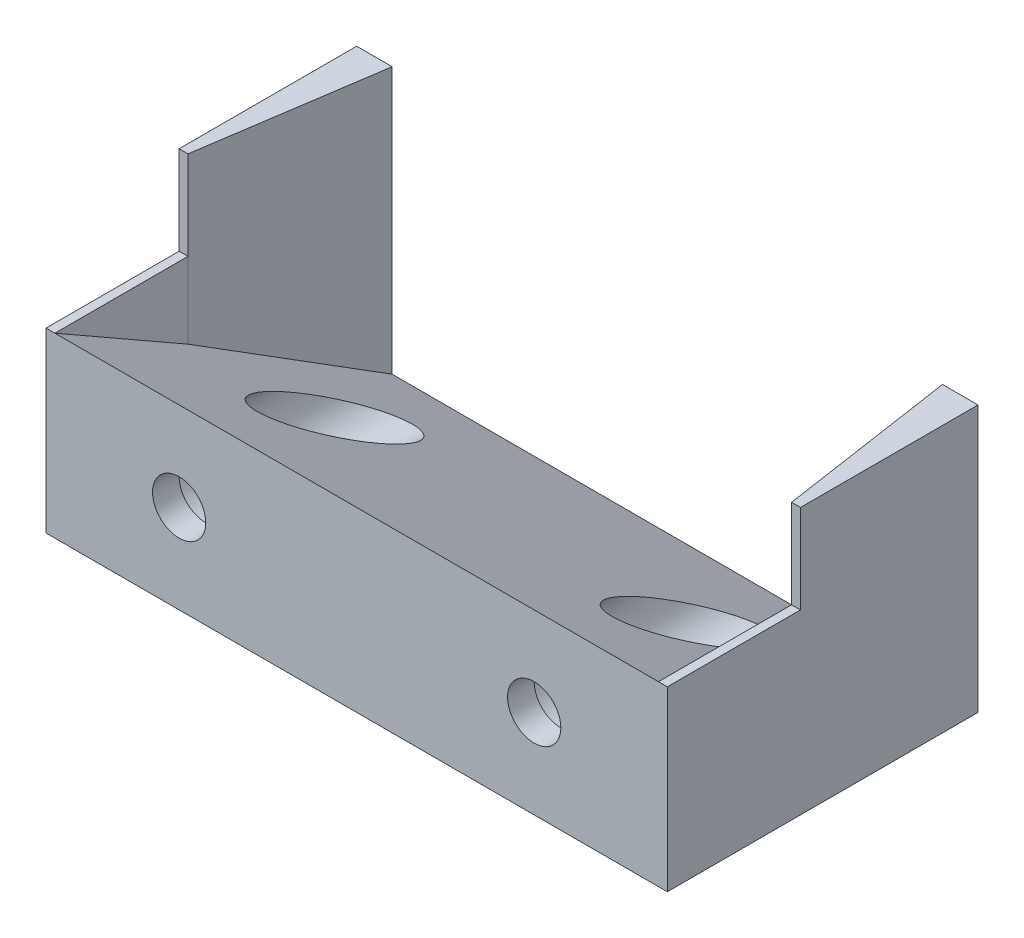
ISO-10303-21;
HEADER;
FILE_DESCRIPTION(('STEP AP214'),'2;1');
FILE_NAME('part.step','',(''),(''),'','','');
FILE_SCHEMA(('AUTOMOTIVE_DESIGN { 1 0 10303 214 1 1 1 1 }'));
ENDSEC;
DATA;
#1=APPLICATION_CONTEXT('core data for automotive mechanical design processes');
#2=APPLICATION_PROTOCOL_DEFINITION('international standard','automotive_design',2000,#1);
#3=PRODUCT_CONTEXT('',#1,'mechanical');
#4=PRODUCT('Part','Part','',(#3));
#5=PRODUCT_RELATED_PRODUCT_CATEGORY('part','',(#4));
#6=PRODUCT_DEFINITION_FORMATION('','',#4);
#7=PRODUCT_DEFINITION_CONTEXT('part definition',#1,'design');
#8=PRODUCT_DEFINITION('design','',#6,#7);
#9=PRODUCT_DEFINITION_SHAPE('','',#8);
#10=(LENGTH_UNIT() NAMED_UNIT(*) SI_UNIT(.MILLI.,.METRE.));
#11=(NAMED_UNIT(*) PLANE_ANGLE_UNIT() SI_UNIT($,.RADIAN.));
#12=(NAMED_UNIT(*) SI_UNIT($,.STERADIAN.) SOLID_ANGLE_UNIT());
#13=UNCERTAINTY_MEASURE_WITH_UNIT(LENGTH_MEASURE(1.E-05),#10,'distance_accuracy_value','');
#14=(GEOMETRIC_REPRESENTATION_CONTEXT(3) GLOBAL_UNCERTAINTY_ASSIGNED_CONTEXT((#13)) GLOBAL_UNIT_ASSIGNED_CONTEXT((#10,
#11,#12)) REPRESENTATION_CONTEXT('',''));
#15=CARTESIAN_POINT('',(0.,0.,0.));
#16=DIRECTION('',(0.,0.,1.));
#17=DIRECTION('',(1.,0.,0.));
#18=AXIS2_PLACEMENT_3D('',#15,#16,#17);
#19=CARTESIAN_POINT('',(-20.,-10.,30.));
#20=DIRECTION('',(0.,0.,-1.));
#21=DIRECTION('',(-1.,0.,0.));
#22=AXIS2_PLACEMENT_3D('',#19,#20,#21);
#23=CYLINDRICAL_SURFACE('',#22,5.);
#24=CARTESIAN_POINT('',(-20.,-10.,-2.5));
#25=DIRECTION('',(0.,0.868243142124459,-0.496138938356834));
#26=DIRECTION('',(0.,-0.496138938356834,-0.868243142124459));
#27=AXIS2_PLACEMENT_3D('',#24,#25,#26);
#28=ELLIPSE('',#27,10.0778221853732,5.);
#29=CARTESIAN_POINT('',(-20.,-15.,-11.25));
#30=VERTEX_POINT('',#29);
#31=EDGE_CURVE('E197',#30,#30,#28,.F.);
#32=ORIENTED_EDGE('',*,*,#31,.F.);
#33=EDGE_LOOP('',(#32));
#34=FACE_BOUND('',#33,.T.);
#35=CARTESIAN_POINT('',(-20.,-10.,12.));
#36=DIRECTION('',(0.,0.,1.));
#37=DIRECTION('',(1.,0.,0.));
#38=AXIS2_PLACEMENT_3D('',#35,#36,#37);
#39=CIRCLE('',#38,5.);
#40=CARTESIAN_POINT('',(-15.,-10.,12.));
#41=VERTEX_POINT('',#40);
#42=EDGE_CURVE('E193',#41,#41,#39,.F.);
#43=ORIENTED_EDGE('',*,*,#42,.F.);
#44=EDGE_LOOP('',(#43));
#45=FACE_BOUND('',#44,.T.);
#46=ADVANCED_FACE('F40',(#34,#45),#23,.F.);
#47=CARTESIAN_POINT('',(20.,-9.99999999999999,30.));
#48=DIRECTION('',(0.,0.,-1.));
#49=DIRECTION('',(-1.,0.,0.));
#50=AXIS2_PLACEMENT_3D('',#47,#48,#49);
#51=CYLINDRICAL_SURFACE('',#50,5.);
#52=CARTESIAN_POINT('',(20.,-9.99999999999999,-2.49999999999999));
#53=DIRECTION('',(0.,0.868243142124459,-0.496138938356834));
#54=DIRECTION('',(0.,-0.496138938356834,-0.868243142124459));
#55=AXIS2_PLACEMENT_3D('',#52,#53,#54);
#56=ELLIPSE('',#55,10.0778221853732,5.);
#57=CARTESIAN_POINT('',(20.,-15.,-11.25));
#58=VERTEX_POINT('',#57);
#59=EDGE_CURVE('E187',#58,#58,#56,.F.);
#60=ORIENTED_EDGE('',*,*,#59,.F.);
#61=EDGE_LOOP('',(#60));
#62=FACE_BOUND('',#61,.T.);
#63=CARTESIAN_POINT('',(20.,-9.99999999999999,12.));
#64=DIRECTION('',(0.,0.,1.));
#65=DIRECTION('',(1.,0.,0.));
#66=AXIS2_PLACEMENT_3D('',#63,#64,#65);
#67=CIRCLE('',#66,5.);
#68=CARTESIAN_POINT('',(25.,-9.99999999999999,12.));
#69=VERTEX_POINT('',#68);
#70=EDGE_CURVE('E190',#69,#69,#67,.F.);
#71=ORIENTED_EDGE('',*,*,#70,.F.);
#72=EDGE_LOOP('',(#71));
#73=FACE_BOUND('',#72,.T.);
#74=ADVANCED_FACE('F310',(#62,#73),#51,.F.);
#75=CARTESIAN_POINT('',(-35.,0.,15.));
#76=DIRECTION('',(0.,-1.,0.));
#77=DIRECTION('',(0.,0.,-1.));
#78=AXIS2_PLACEMENT_3D('',#75,#76,#77);
#79=PLANE('',#78);
#80=DIRECTION('',(-1.,0.,0.));
#81=VECTOR('',#80,1.);
#82=CARTESIAN_POINT('',(35.,0.,0.));
#83=LINE('',#82,#81);
#84=CARTESIAN_POINT('',(35.,0.,0.));
#85=VERTEX_POINT('',#84);
#86=CARTESIAN_POINT('',(34.,0.,0.));
#87=VERTEX_POINT('',#86);
#88=EDGE_CURVE('E194',#85,#87,#83,.T.);
#89=ORIENTED_EDGE('',*,*,#88,.T.);
#90=DIRECTION('',(0.,0.,-1.));
#91=VECTOR('',#90,1.);
#92=CARTESIAN_POINT('',(34.,0.,0.));
#93=LINE('',#92,#91);
#94=CARTESIAN_POINT('',(34.,0.,15.));
#95=VERTEX_POINT('',#94);
#96=EDGE_CURVE('E174',#95,#87,#93,.T.);
#97=ORIENTED_EDGE('',*,*,#96,.F.);
#98=DIRECTION('',(-1.,0.,0.));
#99=VECTOR('',#98,1.);
#100=CARTESIAN_POINT('',(-35.,0.,15.));
#101=LINE('',#100,#99);
#102=CARTESIAN_POINT('',(35.,0.,15.));
#103=VERTEX_POINT('',#102);
#104=EDGE_CURVE('E230',#103,#95,#101,.T.);
#105=ORIENTED_EDGE('',*,*,#104,.F.);
#106=DIRECTION('',(0.,0.,-1.));
#107=VECTOR('',#106,1.);
#108=CARTESIAN_POINT('',(35.,0.,15.));
#109=LINE('',#108,#107);
#110=EDGE_CURVE('E237',#103,#85,#109,.T.);
#111=ORIENTED_EDGE('',*,*,#110,.T.);
#112=EDGE_LOOP('',(#89,#97,#105,#111));
#113=FACE_BOUND('',#112,.T.);
#114=ADVANCED_FACE('F288',(#113),#79,.F.);
#115=CARTESIAN_POINT('',(35.,-20.,0.));
#116=DIRECTION('',(0.,1.,0.));
#117=DIRECTION('',(0.,0.,1.));
#118=AXIS2_PLACEMENT_3D('',#115,#116,#117);
#119=PLANE('',#118);
#120=DIRECTION('',(-1.,0.,0.));
#121=VECTOR('',#120,1.);
#122=CARTESIAN_POINT('',(35.,-20.,-20.));
#123=LINE('',#122,#121);
#124=CARTESIAN_POINT('',(31.,-20.,-20.));
#125=VERTEX_POINT('',#124);
#126=CARTESIAN_POINT('',(-31.,-20.,-20.));
#127=VERTEX_POINT('',#126);
#128=EDGE_CURVE('E243',#125,#127,#123,.T.);
#129=ORIENTED_EDGE('',*,*,#128,.F.);
#130=CARTESIAN_POINT('',(35.,-20.,-20.));
#131=VERTEX_POINT('',#130);
#132=EDGE_CURVE('E55',#131,#125,#123,.T.);
#133=ORIENTED_EDGE('',*,*,#132,.F.);
#134=DIRECTION('',(0.,0.,-1.));
#135=VECTOR('',#134,1.);
#136=CARTESIAN_POINT('',(35.,-20.,0.));
#137=LINE('',#136,#135);
#138=CARTESIAN_POINT('',(35.,-20.,15.));
#139=VERTEX_POINT('',#138);
#140=EDGE_CURVE('E241',#139,#131,#137,.T.);
#141=ORIENTED_EDGE('',*,*,#140,.F.);
#142=DIRECTION('',(1.,0.,0.));
#143=VECTOR('',#142,1.);
#144=CARTESIAN_POINT('',(-35.,-20.,15.));
#145=LINE('',#144,#143);
#146=CARTESIAN_POINT('',(-35.,-20.,15.));
#147=VERTEX_POINT('',#146);
#148=EDGE_CURVE('E224',#147,#139,#145,.T.);
#149=ORIENTED_EDGE('',*,*,#148,.F.);
#150=DIRECTION('',(0.,0.,-1.));
#151=VECTOR('',#150,1.);
#152=CARTESIAN_POINT('',(-35.,-20.,0.));
#153=LINE('',#152,#151);
#154=CARTESIAN_POINT('',(-35.,-20.,-20.));
#155=VERTEX_POINT('',#154);
#156=EDGE_CURVE('E240',#147,#155,#153,.T.);
#157=ORIENTED_EDGE('',*,*,#156,.T.);
#158=DIRECTION('',(1.,0.,0.));
#159=VECTOR('',#158,1.);
#160=CARTESIAN_POINT('',(-35.,-20.,-20.));
#161=LINE('',#160,#159);
#162=EDGE_CURVE('E206',#155,#127,#161,.T.);
#163=ORIENTED_EDGE('',*,*,#162,.T.);
#164=EDGE_LOOP('',(#129,#133,#141,#149,#157,#163));
#165=FACE_BOUND('',#164,.T.);
#166=ADVANCED_FACE('F42',(#165),#119,.F.);
#167=CARTESIAN_POINT('',(35.,0.,0.));
#168=DIRECTION('',(1.,0.,0.));
#169=DIRECTION('',(0.,0.,-1.));
#170=AXIS2_PLACEMENT_3D('',#167,#168,#169);
#171=PLANE('',#170);
#172=ORIENTED_EDGE('',*,*,#110,.F.);
#173=DIRECTION('',(0.,1.,0.));
#174=VECTOR('',#173,1.);
#175=CARTESIAN_POINT('',(35.,0.,15.));
#176=LINE('',#175,#174);
#177=EDGE_CURVE('E227',#139,#103,#176,.T.);
#178=ORIENTED_EDGE('',*,*,#177,.F.);
#179=ORIENTED_EDGE('',*,*,#140,.T.);
#180=DIRECTION('',(0.,-1.,0.));
#181=VECTOR('',#180,1.);
#182=CARTESIAN_POINT('',(35.,10.,-20.));
#183=LINE('',#182,#181);
#184=CARTESIAN_POINT('',(35.,10.,-20.));
#185=VERTEX_POINT('',#184);
#186=EDGE_CURVE('E200',#185,#131,#183,.T.);
#187=ORIENTED_EDGE('',*,*,#186,.F.);
#188=DIRECTION('',(0.,0.,1.));
#189=VECTOR('',#188,1.);
#190=CARTESIAN_POINT('',(35.,10.,0.));
#191=LINE('',#190,#189);
#192=CARTESIAN_POINT('',(35.,10.,0.));
#193=VERTEX_POINT('',#192);
#194=EDGE_CURVE('E135',#185,#193,#191,.T.);
#195=ORIENTED_EDGE('',*,*,#194,.T.);
#196=DIRECTION('',(0.,-1.,0.));
#197=VECTOR('',#196,1.);
#198=CARTESIAN_POINT('',(35.,10.,0.));
#199=LINE('',#198,#197);
#200=EDGE_CURVE('E138',#193,#85,#199,.T.);
#201=ORIENTED_EDGE('',*,*,#200,.T.);
#202=EDGE_LOOP('',(#172,#178,#179,#187,#195,#201));
#203=FACE_BOUND('',#202,.T.);
#204=ADVANCED_FACE('F294',(#203),#171,.T.);
#205=CARTESIAN_POINT('',(-35.,0.,0.));
#206=DIRECTION('',(1.,0.,0.));
#207=DIRECTION('',(0.,0.,-1.));
#208=AXIS2_PLACEMENT_3D('',#205,#206,#207);
#209=PLANE('',#208);
#210=ORIENTED_EDGE('',*,*,#156,.F.);
#211=DIRECTION('',(0.,-1.,0.));
#212=VECTOR('',#211,1.);
#213=CARTESIAN_POINT('',(-35.,0.,15.));
#214=LINE('',#213,#212);
#215=CARTESIAN_POINT('',(-35.,0.,15.));
#216=VERTEX_POINT('',#215);
#217=EDGE_CURVE('E220',#216,#147,#214,.T.);
#218=ORIENTED_EDGE('',*,*,#217,.F.);
#219=DIRECTION('',(0.,0.,-1.));
#220=VECTOR('',#219,1.);
#221=CARTESIAN_POINT('',(-35.,0.,15.));
#222=LINE('',#221,#220);
#223=CARTESIAN_POINT('',(-35.,0.,0.));
#224=VERTEX_POINT('',#223);
#225=EDGE_CURVE('E233',#216,#224,#222,.T.);
#226=ORIENTED_EDGE('',*,*,#225,.T.);
#227=DIRECTION('',(0.,-1.,0.));
#228=VECTOR('',#227,1.);
#229=CARTESIAN_POINT('',(-35.,10.,0.));
#230=LINE('',#229,#228);
#231=CARTESIAN_POINT('',(-35.,10.,0.));
#232=VERTEX_POINT('',#231);
#233=EDGE_CURVE('E217',#232,#224,#230,.T.);
#234=ORIENTED_EDGE('',*,*,#233,.F.);
#235=DIRECTION('',(0.,0.,-1.));
#236=VECTOR('',#235,1.);
#237=CARTESIAN_POINT('',(-35.,10.,0.));
#238=LINE('',#237,#236);
#239=CARTESIAN_POINT('',(-35.,10.,-20.));
#240=VERTEX_POINT('',#239);
#241=EDGE_CURVE('E207',#232,#240,#238,.T.);
#242=ORIENTED_EDGE('',*,*,#241,.T.);
#243=DIRECTION('',(0.,-1.,0.));
#244=VECTOR('',#243,1.);
#245=CARTESIAN_POINT('',(-35.,10.,-20.));
#246=LINE('',#245,#244);
#247=EDGE_CURVE('E214',#240,#155,#246,.T.);
#248=ORIENTED_EDGE('',*,*,#247,.T.);
#249=EDGE_LOOP('',(#210,#218,#226,#234,#242,#248));
#250=FACE_BOUND('',#249,.T.);
#251=ADVANCED_FACE('F274',(#250),#209,.F.);
#252=CARTESIAN_POINT('',(-34.,0.,15.));
#253=VERTEX_POINT('',#252);
#254=EDGE_CURVE('E229',#253,#216,#101,.T.);
#255=ORIENTED_EDGE('',*,*,#254,.F.);
#256=DIRECTION('',(0.,0.,1.));
#257=VECTOR('',#256,1.);
#258=CARTESIAN_POINT('',(-34.,0.,0.));
#259=LINE('',#258,#257);
#260=CARTESIAN_POINT('',(-34.,0.,0.));
#261=VERTEX_POINT('',#260);
#262=EDGE_CURVE('E163',#261,#253,#259,.T.);
#263=ORIENTED_EDGE('',*,*,#262,.F.);
#264=EDGE_CURVE('E246',#261,#224,#83,.T.);
#265=ORIENTED_EDGE('',*,*,#264,.T.);
#266=ORIENTED_EDGE('',*,*,#225,.F.);
#267=EDGE_LOOP('',(#255,#263,#265,#266));
#268=FACE_BOUND('',#267,.T.);
#269=ADVANCED_FACE('F258',(#268),#79,.F.);
#270=CARTESIAN_POINT('',(0.,0.,15.));
#271=DIRECTION('',(0.,0.,1.));
#272=DIRECTION('',(1.,0.,0.));
#273=AXIS2_PLACEMENT_3D('',#270,#271,#272);
#274=PLANE('',#273);
#275=ORIENTED_EDGE('',*,*,#177,.T.);
#276=ORIENTED_EDGE('',*,*,#104,.T.);
#277=EDGE_CURVE('E234',#95,#253,#101,.T.);
#278=ORIENTED_EDGE('',*,*,#277,.T.);
#279=ORIENTED_EDGE('',*,*,#254,.T.);
#280=ORIENTED_EDGE('',*,*,#217,.T.);
#281=ORIENTED_EDGE('',*,*,#148,.T.);
#282=EDGE_LOOP('',(#275,#276,#278,#279,#280,#281));
#283=FACE_BOUND('',#282,.T.);
#284=CARTESIAN_POINT('',(20.,-9.99999999999999,15.));
#285=DIRECTION('',(0.,0.,1.));
#286=DIRECTION('',(1.,0.,0.));
#287=AXIS2_PLACEMENT_3D('',#284,#285,#286);
#288=CIRCLE('',#287,3.);
#289=CARTESIAN_POINT('',(23.,-9.99999999999999,15.));
#290=VERTEX_POINT('',#289);
#291=EDGE_CURVE('E177',#290,#290,#288,.T.);
#292=ORIENTED_EDGE('',*,*,#291,.F.);
#293=EDGE_LOOP('',(#292));
#294=FACE_BOUND('',#293,.T.);
#295=CARTESIAN_POINT('',(-20.,-10.,15.));
#296=DIRECTION('',(0.,0.,1.));
#297=DIRECTION('',(1.,0.,0.));
#298=AXIS2_PLACEMENT_3D('',#295,#296,#297);
#299=CIRCLE('',#298,3.);
#300=CARTESIAN_POINT('',(-17.,-10.,15.));
#301=VERTEX_POINT('',#300);
#302=EDGE_CURVE('E181',#301,#301,#299,.T.);
#303=ORIENTED_EDGE('',*,*,#302,.F.);
#304=EDGE_LOOP('',(#303));
#305=FACE_BOUND('',#304,.T.);
#306=ADVANCED_FACE('F278',(#283,#294,#305),#274,.T.);
#307=CARTESIAN_POINT('',(-35.,10.,0.));
#308=DIRECTION('',(0.,0.,1.));
#309=DIRECTION('',(1.,0.,0.));
#310=AXIS2_PLACEMENT_3D('',#307,#308,#309);
#311=PLANE('',#310);
#312=DIRECTION('',(0.,-1.,0.));
#313=VECTOR('',#312,1.);
#314=CARTESIAN_POINT('',(-34.,10.,0.));
#315=LINE('',#314,#313);
#316=CARTESIAN_POINT('',(-34.,9.99999999999999,0.));
#317=VERTEX_POINT('',#316);
#318=EDGE_CURVE('E169',#317,#261,#315,.T.);
#319=ORIENTED_EDGE('',*,*,#318,.F.);
#320=DIRECTION('',(-1.,0.,0.));
#321=VECTOR('',#320,1.);
#322=CARTESIAN_POINT('',(-35.,10.,0.));
#323=LINE('',#322,#321);
#324=EDGE_CURVE('E212',#317,#232,#323,.T.);
#325=ORIENTED_EDGE('',*,*,#324,.T.);
#326=ORIENTED_EDGE('',*,*,#233,.T.);
#327=ORIENTED_EDGE('',*,*,#264,.F.);
#328=EDGE_LOOP('',(#319,#325,#326,#327));
#329=FACE_BOUND('',#328,.T.);
#330=ADVANCED_FACE('F263',(#329),#311,.T.);
#331=CARTESIAN_POINT('',(-35.,10.,-20.));
#332=DIRECTION('',(0.,0.,-1.));
#333=DIRECTION('',(-1.,0.,0.));
#334=AXIS2_PLACEMENT_3D('',#331,#332,#333);
#335=PLANE('',#334);
#336=DIRECTION('',(1.,0.,0.));
#337=VECTOR('',#336,1.);
#338=CARTESIAN_POINT('',(-35.,10.,-20.));
#339=LINE('',#338,#337);
#340=CARTESIAN_POINT('',(-31.,9.99999999999999,-20.));
#341=VERTEX_POINT('',#340);
#342=EDGE_CURVE('E210',#240,#341,#339,.T.);
#343=ORIENTED_EDGE('',*,*,#342,.T.);
#344=DIRECTION('',(0.,-1.,0.));
#345=VECTOR('',#344,1.);
#346=CARTESIAN_POINT('',(-31.,9.99999999999999,-20.));
#347=LINE('',#346,#345);
#348=EDGE_CURVE('E157',#341,#127,#347,.T.);
#349=ORIENTED_EDGE('',*,*,#348,.T.);
#350=ORIENTED_EDGE('',*,*,#162,.F.);
#351=ORIENTED_EDGE('',*,*,#247,.F.);
#352=EDGE_LOOP('',(#343,#349,#350,#351));
#353=FACE_BOUND('',#352,.T.);
#354=ADVANCED_FACE('F299',(#353),#335,.T.);
#355=CARTESIAN_POINT('',(0.,10.,0.));
#356=DIRECTION('',(0.,-1.,0.));
#357=DIRECTION('',(0.,0.,-1.));
#358=AXIS2_PLACEMENT_3D('',#355,#356,#357);
#359=PLANE('',#358);
#360=ORIENTED_EDGE('',*,*,#324,.F.);
#361=DIRECTION('',(-0.148340452930245,0.,0.988936352868298));
#362=VECTOR('',#361,1.);
#363=CARTESIAN_POINT('',(-31.,9.99999999999999,-20.));
#364=LINE('',#363,#362);
#365=EDGE_CURVE('E152',#341,#317,#364,.T.);
#366=ORIENTED_EDGE('',*,*,#365,.F.);
#367=ORIENTED_EDGE('',*,*,#342,.F.);
#368=ORIENTED_EDGE('',*,*,#241,.F.);
#369=EDGE_LOOP('',(#360,#366,#367,#368));
#370=FACE_BOUND('',#369,.T.);
#371=ADVANCED_FACE('F270',(#370),#359,.F.);
#372=CARTESIAN_POINT('',(35.,10.,0.));
#373=DIRECTION('',(0.,0.,1.));
#374=DIRECTION('',(1.,0.,0.));
#375=AXIS2_PLACEMENT_3D('',#372,#373,#374);
#376=PLANE('',#375);
#377=DIRECTION('',(0.,1.,0.));
#378=VECTOR('',#377,1.);
#379=CARTESIAN_POINT('',(34.,10.,0.));
#380=LINE('',#379,#378);
#381=CARTESIAN_POINT('',(34.,10.,0.));
#382=VERTEX_POINT('',#381);
#383=EDGE_CURVE('E149',#87,#382,#380,.T.);
#384=ORIENTED_EDGE('',*,*,#383,.F.);
#385=ORIENTED_EDGE('',*,*,#88,.F.);
#386=ORIENTED_EDGE('',*,*,#200,.F.);
#387=DIRECTION('',(-1.,0.,0.));
#388=VECTOR('',#387,1.);
#389=CARTESIAN_POINT('',(35.,10.,0.));
#390=LINE('',#389,#388);
#391=EDGE_CURVE('E137',#193,#382,#390,.T.);
#392=ORIENTED_EDGE('',*,*,#391,.T.);
#393=EDGE_LOOP('',(#384,#385,#386,#392));
#394=FACE_BOUND('',#393,.T.);
#395=ADVANCED_FACE('F291',(#394),#376,.T.);
#396=CARTESIAN_POINT('',(35.,10.,-20.));
#397=DIRECTION('',(0.,0.,-1.));
#398=DIRECTION('',(-1.,0.,0.));
#399=AXIS2_PLACEMENT_3D('',#396,#397,#398);
#400=PLANE('',#399);
#401=ORIENTED_EDGE('',*,*,#132,.T.);
#402=DIRECTION('',(0.,-1.,0.));
#403=VECTOR('',#402,1.);
#404=CARTESIAN_POINT('',(31.,9.99999999999999,-20.));
#405=LINE('',#404,#403);
#406=CARTESIAN_POINT('',(31.,9.99999999999999,-20.));
#407=VERTEX_POINT('',#406);
#408=EDGE_CURVE('E141',#407,#125,#405,.T.);
#409=ORIENTED_EDGE('',*,*,#408,.F.);
#410=DIRECTION('',(1.,0.,0.));
#411=VECTOR('',#410,1.);
#412=CARTESIAN_POINT('',(35.,10.,-20.));
#413=LINE('',#412,#411);
#414=EDGE_CURVE('E129',#407,#185,#413,.T.);
#415=ORIENTED_EDGE('',*,*,#414,.T.);
#416=ORIENTED_EDGE('',*,*,#186,.T.);
#417=EDGE_LOOP('',(#401,#409,#415,#416));
#418=FACE_BOUND('',#417,.T.);
#419=ADVANCED_FACE('F142',(#418),#400,.T.);
#420=CARTESIAN_POINT('',(0.,10.,0.));
#421=DIRECTION('',(0.,1.,0.));
#422=DIRECTION('',(0.,0.,1.));
#423=AXIS2_PLACEMENT_3D('',#420,#421,#422);
#424=PLANE('',#423);
#425=ORIENTED_EDGE('',*,*,#414,.F.);
#426=DIRECTION('',(-0.148340452930245,0.,-0.988936352868298));
#427=VECTOR('',#426,1.);
#428=CARTESIAN_POINT('',(31.,9.99999999999999,-20.));
#429=LINE('',#428,#427);
#430=EDGE_CURVE('E133',#382,#407,#429,.T.);
#431=ORIENTED_EDGE('',*,*,#430,.F.);
#432=ORIENTED_EDGE('',*,*,#391,.F.);
#433=ORIENTED_EDGE('',*,*,#194,.F.);
#434=EDGE_LOOP('',(#425,#431,#432,#433));
#435=FACE_BOUND('',#434,.T.);
#436=ADVANCED_FACE('F130',(#435),#424,.T.);
#437=CARTESIAN_POINT('',(33.,0.,15.));
#438=DIRECTION('',(0.,0.868243142124459,-0.496138938356834));
#439=DIRECTION('',(0.,0.496138938356834,0.868243142124459));
#440=AXIS2_PLACEMENT_3D('',#437,#438,#439);
#441=PLANE('',#440);
#442=DIRECTION('',(0.12914582074743,0.491984079037829,0.860972138316201));
#443=VECTOR('',#442,1.);
#444=CARTESIAN_POINT('',(36.1957944101963,-0.206497484966529,14.6386294013086));
#445=LINE('',#444,#443);
#446=CARTESIAN_POINT('',(34.,-8.57142857142857,0.));
#447=VERTEX_POINT('',#446);
#448=EDGE_CURVE('E150',#125,#447,#445,.T.);
#449=ORIENTED_EDGE('',*,*,#448,.F.);
#450=ORIENTED_EDGE('',*,*,#128,.T.);
#451=DIRECTION('',(0.12914582074743,-0.491984079037829,-0.860972138316201));
#452=VECTOR('',#451,1.);
#453=CARTESIAN_POINT('',(-35.0950039711055,-4.39998487197912,7.30002647403654));
#454=LINE('',#453,#452);
#455=CARTESIAN_POINT('',(-34.,-8.57142857142857,0.));
#456=VERTEX_POINT('',#455);
#457=EDGE_CURVE('E160',#456,#127,#454,.T.);
#458=ORIENTED_EDGE('',*,*,#457,.F.);
#459=DIRECTION('',(0.,-0.496138938356834,-0.868243142124459));
#460=VECTOR('',#459,1.);
#461=CARTESIAN_POINT('',(-34.,0.,15.));
#462=LINE('',#461,#460);
#463=EDGE_CURVE('E166',#253,#456,#462,.T.);
#464=ORIENTED_EDGE('',*,*,#463,.F.);
#465=ORIENTED_EDGE('',*,*,#277,.F.);
#466=DIRECTION('',(0.,0.496138938356834,0.868243142124459));
#467=VECTOR('',#466,1.);
#468=CARTESIAN_POINT('',(34.,0.,15.));
#469=LINE('',#468,#467);
#470=EDGE_CURVE('E172',#447,#95,#469,.T.);
#471=ORIENTED_EDGE('',*,*,#470,.F.);
#472=EDGE_LOOP('',(#449,#450,#458,#464,#465,#471));
#473=FACE_BOUND('',#472,.T.);
#474=ORIENTED_EDGE('',*,*,#59,.T.);
#475=EDGE_LOOP('',(#474));
#476=FACE_BOUND('',#475,.T.);
#477=ORIENTED_EDGE('',*,*,#31,.T.);
#478=EDGE_LOOP('',(#477));
#479=FACE_BOUND('',#478,.T.);
#480=ADVANCED_FACE('F285',(#473,#476,#479),#441,.T.);
#481=CARTESIAN_POINT('',(0.,0.,12.));
#482=DIRECTION('',(0.,0.,1.));
#483=DIRECTION('',(1.,0.,0.));
#484=AXIS2_PLACEMENT_3D('',#481,#482,#483);
#485=PLANE('',#484);
#486=CARTESIAN_POINT('',(20.,-9.99999999999999,12.));
#487=DIRECTION('',(0.,0.,1.));
#488=DIRECTION('',(1.,0.,0.));
#489=AXIS2_PLACEMENT_3D('',#486,#487,#488);
#490=CIRCLE('',#489,3.);
#491=CARTESIAN_POINT('',(23.,-9.99999999999999,12.));
#492=VERTEX_POINT('',#491);
#493=EDGE_CURVE('E178',#492,#492,#490,.T.);
#494=ORIENTED_EDGE('',*,*,#493,.T.);
#495=EDGE_LOOP('',(#494));
#496=FACE_BOUND('',#495,.T.);
#497=ORIENTED_EDGE('',*,*,#70,.T.);
#498=EDGE_LOOP('',(#497));
#499=FACE_BOUND('',#498,.T.);
#500=ADVANCED_FACE('F330',(#496,#499),#485,.F.);
#501=CARTESIAN_POINT('',(20.,-9.99999999999999,12.));
#502=DIRECTION('',(0.,0.,1.));
#503=DIRECTION('',(1.,0.,0.));
#504=AXIS2_PLACEMENT_3D('',#501,#502,#503);
#505=CYLINDRICAL_SURFACE('',#504,3.);
#506=ORIENTED_EDGE('',*,*,#493,.F.);
#507=EDGE_LOOP('',(#506));
#508=FACE_BOUND('',#507,.T.);
#509=ORIENTED_EDGE('',*,*,#291,.T.);
#510=EDGE_LOOP('',(#509));
#511=FACE_BOUND('',#510,.T.);
#512=ADVANCED_FACE('F335',(#508,#511),#505,.F.);
#513=CARTESIAN_POINT('',(-20.,-10.,12.));
#514=DIRECTION('',(0.,0.,1.));
#515=DIRECTION('',(1.,0.,0.));
#516=AXIS2_PLACEMENT_3D('',#513,#514,#515);
#517=CIRCLE('',#516,3.);
#518=CARTESIAN_POINT('',(-17.,-10.,12.));
#519=VERTEX_POINT('',#518);
#520=EDGE_CURVE('E184',#519,#519,#517,.T.);
#521=ORIENTED_EDGE('',*,*,#520,.T.);
#522=EDGE_LOOP('',(#521));
#523=FACE_BOUND('',#522,.T.);
#524=ORIENTED_EDGE('',*,*,#42,.T.);
#525=EDGE_LOOP('',(#524));
#526=FACE_BOUND('',#525,.T.);
#527=ADVANCED_FACE('F338',(#523,#526),#485,.F.);
#528=CARTESIAN_POINT('',(-20.,-10.,12.));
#529=DIRECTION('',(0.,0.,1.));
#530=DIRECTION('',(1.,0.,0.));
#531=AXIS2_PLACEMENT_3D('',#528,#529,#530);
#532=CYLINDRICAL_SURFACE('',#531,3.);
#533=ORIENTED_EDGE('',*,*,#520,.F.);
#534=EDGE_LOOP('',(#533));
#535=FACE_BOUND('',#534,.T.);
#536=ORIENTED_EDGE('',*,*,#302,.T.);
#537=EDGE_LOOP('',(#536));
#538=FACE_BOUND('',#537,.T.);
#539=ADVANCED_FACE('F341',(#535,#538),#532,.F.);
#540=CARTESIAN_POINT('',(34.,0.,0.));
#541=DIRECTION('',(1.,0.,0.));
#542=DIRECTION('',(0.,0.,-1.));
#543=AXIS2_PLACEMENT_3D('',#540,#541,#542);
#544=PLANE('',#543);
#545=ORIENTED_EDGE('',*,*,#96,.T.);
#546=DIRECTION('',(0.,-1.,0.));
#547=VECTOR('',#546,1.);
#548=CARTESIAN_POINT('',(34.,0.,0.));
#549=LINE('',#548,#547);
#550=EDGE_CURVE('E11',#87,#447,#549,.T.);
#551=ORIENTED_EDGE('',*,*,#550,.T.);
#552=ORIENTED_EDGE('',*,*,#470,.T.);
#553=EDGE_LOOP('',(#545,#551,#552));
#554=FACE_BOUND('',#553,.T.);
#555=ADVANCED_FACE('F289',(#554),#544,.F.);
#556=CARTESIAN_POINT('',(-34.,0.,0.));
#557=DIRECTION('',(-1.,0.,0.));
#558=DIRECTION('',(0.,0.,1.));
#559=AXIS2_PLACEMENT_3D('',#556,#557,#558);
#560=PLANE('',#559);
#561=ORIENTED_EDGE('',*,*,#463,.T.);
#562=DIRECTION('',(0.,1.,0.));
#563=VECTOR('',#562,1.);
#564=CARTESIAN_POINT('',(-34.,0.,0.));
#565=LINE('',#564,#563);
#566=EDGE_CURVE('E48',#456,#261,#565,.T.);
#567=ORIENTED_EDGE('',*,*,#566,.T.);
#568=ORIENTED_EDGE('',*,*,#262,.T.);
#569=EDGE_LOOP('',(#561,#567,#568));
#570=FACE_BOUND('',#569,.T.);
#571=ADVANCED_FACE('F253',(#570),#560,.F.);
#572=CARTESIAN_POINT('',(-31.,9.99999999999999,-20.));
#573=DIRECTION('',(0.988936352868298,0.,0.148340452930245));
#574=DIRECTION('',(0.148340452930245,0.,-0.988936352868298));
#575=AXIS2_PLACEMENT_3D('',#572,#573,#574);
#576=PLANE('',#575);
#577=ORIENTED_EDGE('',*,*,#566,.F.);
#578=ORIENTED_EDGE('',*,*,#457,.T.);
#579=ORIENTED_EDGE('',*,*,#348,.F.);
#580=ORIENTED_EDGE('',*,*,#365,.T.);
#581=ORIENTED_EDGE('',*,*,#318,.T.);
#582=EDGE_LOOP('',(#577,#578,#579,#580,#581));
#583=FACE_BOUND('',#582,.T.);
#584=ADVANCED_FACE('F265',(#583),#576,.T.);
#585=CARTESIAN_POINT('',(31.,9.99999999999999,-20.));
#586=DIRECTION('',(-0.988936352868298,0.,0.148340452930245));
#587=DIRECTION('',(0.148340452930245,0.,0.988936352868298));
#588=AXIS2_PLACEMENT_3D('',#585,#586,#587);
#589=PLANE('',#588);
#590=ORIENTED_EDGE('',*,*,#408,.T.);
#591=ORIENTED_EDGE('',*,*,#448,.T.);
#592=ORIENTED_EDGE('',*,*,#550,.F.);
#593=ORIENTED_EDGE('',*,*,#383,.T.);
#594=ORIENTED_EDGE('',*,*,#430,.T.);
#595=EDGE_LOOP('',(#590,#591,#592,#593,#594));
#596=FACE_BOUND('',#595,.T.);
#597=ADVANCED_FACE('F147',(#596),#589,.T.);
#598=CLOSED_SHELL('',(#46,#74,#114,#166,#204,#251,#269,#306,#330,#354,#371,#395,#419,#436,#480,
#500,#512,#527,#539,#555,#571,#584,#597));
#599=MANIFOLD_SOLID_BREP('B2',#598);
#600=ADVANCED_BREP_SHAPE_REPRESENTATION('',(#18,#599),#14);
#601=SHAPE_DEFINITION_REPRESENTATION(#9,#600);
ENDSEC;
END-ISO-10303-21;
